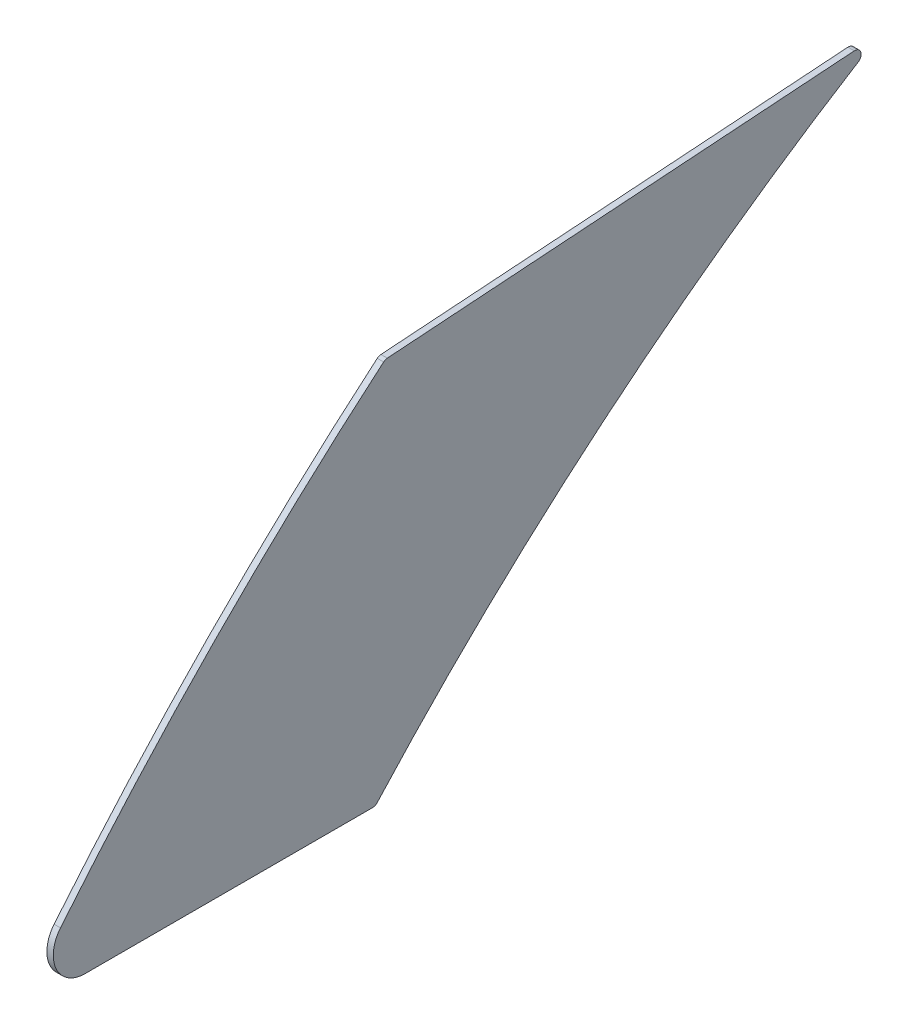
ISO-10303-21;
HEADER;
FILE_DESCRIPTION(('STEP AP214'),'2;1');
FILE_NAME('part.step','',(''),(''),'','','');
FILE_SCHEMA(('AUTOMOTIVE_DESIGN { 1 0 10303 214 1 1 1 1 }'));
ENDSEC;
DATA;
#1=APPLICATION_CONTEXT('core data for automotive mechanical design processes');
#2=APPLICATION_PROTOCOL_DEFINITION('international standard','automotive_design',2000,#1);
#3=PRODUCT_CONTEXT('',#1,'mechanical');
#4=PRODUCT('Part','Part','',(#3));
#5=PRODUCT_RELATED_PRODUCT_CATEGORY('part','',(#4));
#6=PRODUCT_DEFINITION_FORMATION('','',#4);
#7=PRODUCT_DEFINITION_CONTEXT('part definition',#1,'design');
#8=PRODUCT_DEFINITION('design','',#6,#7);
#9=PRODUCT_DEFINITION_SHAPE('','',#8);
#10=(LENGTH_UNIT() NAMED_UNIT(*) SI_UNIT(.MILLI.,.METRE.));
#11=(NAMED_UNIT(*) PLANE_ANGLE_UNIT() SI_UNIT($,.RADIAN.));
#12=(NAMED_UNIT(*) SI_UNIT($,.STERADIAN.) SOLID_ANGLE_UNIT());
#13=UNCERTAINTY_MEASURE_WITH_UNIT(LENGTH_MEASURE(1.E-05),#10,'distance_accuracy_value','');
#14=(GEOMETRIC_REPRESENTATION_CONTEXT(3) GLOBAL_UNCERTAINTY_ASSIGNED_CONTEXT((#13)) GLOBAL_UNIT_ASSIGNED_CONTEXT((#10,
#11,#12)) REPRESENTATION_CONTEXT('',''));
#15=CARTESIAN_POINT('',(0.,0.,0.));
#16=DIRECTION('',(0.,0.,1.));
#17=DIRECTION('',(1.,0.,0.));
#18=AXIS2_PLACEMENT_3D('',#15,#16,#17);
#19=CARTESIAN_POINT('',(1.,-55.,47.1687635097814));
#20=DIRECTION('',(-1.,0.,0.));
#21=DIRECTION('',(0.,0.,1.));
#22=AXIS2_PLACEMENT_3D('',#19,#20,#21);
#23=CYLINDRICAL_SURFACE('',#22,5.00000000000001);
#24=CARTESIAN_POINT('',(0.,-55.,47.1687635097814));
#25=DIRECTION('',(1.,0.,0.));
#26=DIRECTION('',(0.,0.,1.));
#27=AXIS2_PLACEMENT_3D('',#24,#25,#26);
#28=CIRCLE('',#27,5.00000000000001);
#29=CARTESIAN_POINT('',(0.,-51.8303535996389,51.0357186034796));
#30=VERTEX_POINT('',#29);
#31=CARTESIAN_POINT('',(0.,-60.,47.1687635097814));
#32=VERTEX_POINT('',#31);
#33=EDGE_CURVE('E129',#30,#32,#28,.T.);
#34=ORIENTED_EDGE('',*,*,#33,.T.);
#35=DIRECTION('',(-1.,0.,0.));
#36=VECTOR('',#35,1.);
#37=CARTESIAN_POINT('',(1.,-60.,47.1687635097814));
#38=LINE('',#37,#36);
#39=CARTESIAN_POINT('',(1.,-60.,47.1687635097814));
#40=VERTEX_POINT('',#39);
#41=EDGE_CURVE('E11',#40,#32,#38,.T.);
#42=ORIENTED_EDGE('',*,*,#41,.F.);
#43=CARTESIAN_POINT('',(1.,-55.,47.1687635097814));
#44=DIRECTION('',(1.,0.,0.));
#45=DIRECTION('',(0.,0.,1.));
#46=AXIS2_PLACEMENT_3D('',#43,#44,#45);
#47=CIRCLE('',#46,5.00000000000001);
#48=CARTESIAN_POINT('',(1.,-51.8303535996389,51.0357186034796));
#49=VERTEX_POINT('',#48);
#50=EDGE_CURVE('E143',#49,#40,#47,.T.);
#51=ORIENTED_EDGE('',*,*,#50,.F.);
#52=DIRECTION('',(-1.,0.,0.));
#53=VECTOR('',#52,1.);
#54=CARTESIAN_POINT('',(1.,-51.8303535996389,51.0357186034796));
#55=LINE('',#54,#53);
#56=EDGE_CURVE('E125',#49,#30,#55,.T.);
#57=ORIENTED_EDGE('',*,*,#56,.T.);
#58=EDGE_LOOP('',(#34,#42,#51,#57));
#59=FACE_BOUND('',#58,.T.);
#60=ADVANCED_FACE('F33',(#59),#23,.T.);
#61=CARTESIAN_POINT('',(1.,-60.,47.1687635097814));
#62=DIRECTION('',(0.,1.,0.));
#63=DIRECTION('',(0.,0.,1.));
#64=AXIS2_PLACEMENT_3D('',#61,#62,#63);
#65=PLANE('',#64);
#66=DIRECTION('',(0.,0.,-1.));
#67=VECTOR('',#66,1.);
#68=CARTESIAN_POINT('',(0.,-60.,47.1687635097814));
#69=LINE('',#68,#67);
#70=CARTESIAN_POINT('',(0.,-60.,1.99999999999999));
#71=VERTEX_POINT('',#70);
#72=EDGE_CURVE('E132',#32,#71,#69,.T.);
#73=ORIENTED_EDGE('',*,*,#72,.T.);
#74=DIRECTION('',(-1.,0.,0.));
#75=VECTOR('',#74,1.);
#76=CARTESIAN_POINT('',(1.,-60.,1.99999999999999));
#77=LINE('',#76,#75);
#78=CARTESIAN_POINT('',(1.,-60.,1.99999999999999));
#79=VERTEX_POINT('',#78);
#80=EDGE_CURVE('E41',#79,#71,#77,.T.);
#81=ORIENTED_EDGE('',*,*,#80,.F.);
#82=DIRECTION('',(0.,0.,-1.));
#83=VECTOR('',#82,1.);
#84=CARTESIAN_POINT('',(1.,-60.,47.1687635097814));
#85=LINE('',#84,#83);
#86=EDGE_CURVE('E92',#40,#79,#85,.T.);
#87=ORIENTED_EDGE('',*,*,#86,.F.);
#88=ORIENTED_EDGE('',*,*,#41,.T.);
#89=EDGE_LOOP('',(#73,#81,#87,#88));
#90=FACE_BOUND('',#89,.T.);
#91=ADVANCED_FACE('F178',(#90),#65,.F.);
#92=CARTESIAN_POINT('',(1.,-59.,1.99999999999999));
#93=DIRECTION('',(-1.,0.,0.));
#94=DIRECTION('',(0.,0.,1.));
#95=AXIS2_PLACEMENT_3D('',#92,#93,#94);
#96=CYLINDRICAL_SURFACE('',#95,1.);
#97=CARTESIAN_POINT('',(0.,-59.,1.99999999999999));
#98=DIRECTION('',(1.,0.,0.));
#99=DIRECTION('',(0.,0.,-1.));
#100=AXIS2_PLACEMENT_3D('',#97,#98,#99);
#101=CIRCLE('',#100,1.);
#102=CARTESIAN_POINT('',(0.,-59.6706210006683,1.25819984263775));
#103=VERTEX_POINT('',#102);
#104=EDGE_CURVE('E134',#71,#103,#101,.T.);
#105=ORIENTED_EDGE('',*,*,#104,.T.);
#106=DIRECTION('',(-1.,0.,0.));
#107=VECTOR('',#106,1.);
#108=CARTESIAN_POINT('',(1.,-59.6706210006683,1.25819984263775));
#109=LINE('',#108,#107);
#110=CARTESIAN_POINT('',(1.,-59.6706210006683,1.25819984263775));
#111=VERTEX_POINT('',#110);
#112=EDGE_CURVE('E150',#111,#103,#109,.T.);
#113=ORIENTED_EDGE('',*,*,#112,.F.);
#114=CARTESIAN_POINT('',(1.,-59.,1.99999999999999));
#115=DIRECTION('',(1.,0.,0.));
#116=DIRECTION('',(0.,0.,-1.));
#117=AXIS2_PLACEMENT_3D('',#114,#115,#116);
#118=CIRCLE('',#117,1.);
#119=EDGE_CURVE('E158',#79,#111,#118,.T.);
#120=ORIENTED_EDGE('',*,*,#119,.F.);
#121=ORIENTED_EDGE('',*,*,#80,.T.);
#122=EDGE_LOOP('',(#105,#113,#120,#121));
#123=FACE_BOUND('',#122,.T.);
#124=ADVANCED_FACE('F156',(#123),#96,.T.);
#125=CARTESIAN_POINT('',(1.,-294.387971234575,-258.371855234146));
#126=DIRECTION('',(-1.,0.,0.));
#127=DIRECTION('',(0.,0.,1.));
#128=AXIS2_PLACEMENT_3D('',#125,#126,#127);
#129=CYLINDRICAL_SURFACE('',#128,350.);
#130=CARTESIAN_POINT('',(0.,-294.387971234575,-258.371855234146));
#131=DIRECTION('',(-1.,0.,0.));
#132=DIRECTION('',(0.,0.,1.));
#133=AXIS2_PLACEMENT_3D('',#130,#131,#132);
#134=CIRCLE('',#133,350.);
#135=CARTESIAN_POINT('',(0.,3.30665253271911,-74.3123241577865));
#136=VERTEX_POINT('',#135);
#137=EDGE_CURVE('E136',#103,#136,#134,.T.);
#138=ORIENTED_EDGE('',*,*,#137,.T.);
#139=DIRECTION('',(-1.,0.,0.));
#140=VECTOR('',#139,1.);
#141=CARTESIAN_POINT('',(1.,3.30665253271911,-74.3123241577865));
#142=LINE('',#141,#140);
#143=CARTESIAN_POINT('',(1.,3.30665253271911,-74.3123241577865));
#144=VERTEX_POINT('',#143);
#145=EDGE_CURVE('E147',#144,#136,#142,.T.);
#146=ORIENTED_EDGE('',*,*,#145,.F.);
#147=CARTESIAN_POINT('',(1.,-294.387971234575,-258.371855234146));
#148=DIRECTION('',(-1.,0.,0.));
#149=DIRECTION('',(0.,0.,1.));
#150=AXIS2_PLACEMENT_3D('',#147,#148,#149);
#151=CIRCLE('',#150,350.);
#152=EDGE_CURVE('E170',#111,#144,#151,.T.);
#153=ORIENTED_EDGE('',*,*,#152,.F.);
#154=ORIENTED_EDGE('',*,*,#112,.T.);
#155=EDGE_LOOP('',(#138,#146,#153,#154));
#156=FACE_BOUND('',#155,.T.);
#157=ADVANCED_FACE('F166',(#156),#129,.F.);
#158=CARTESIAN_POINT('',(1.,4.15720860062574,-73.7864397832826));
#159=DIRECTION('',(-1.,0.,0.));
#160=DIRECTION('',(0.,0.,1.));
#161=AXIS2_PLACEMENT_3D('',#158,#159,#160);
#162=CYLINDRICAL_SURFACE('',#161,0.999999999999939);
#163=CARTESIAN_POINT('',(0.,4.15720860062574,-73.7864397832826));
#164=DIRECTION('',(1.,0.,0.));
#165=DIRECTION('',(0.,0.,1.));
#166=AXIS2_PLACEMENT_3D('',#163,#164,#165);
#167=CIRCLE('',#166,0.999999999999939);
#168=CARTESIAN_POINT('',(0.,5.1547726508855,-73.7166833095385));
#169=VERTEX_POINT('',#168);
#170=EDGE_CURVE('E138',#136,#169,#167,.T.);
#171=ORIENTED_EDGE('',*,*,#170,.T.);
#172=DIRECTION('',(-1.,0.,0.));
#173=VECTOR('',#172,1.);
#174=CARTESIAN_POINT('',(1.,5.1547726508855,-73.7166833095385));
#175=LINE('',#174,#173);
#176=CARTESIAN_POINT('',(1.,5.1547726508855,-73.7166833095385));
#177=VERTEX_POINT('',#176);
#178=EDGE_CURVE('E120',#177,#169,#175,.T.);
#179=ORIENTED_EDGE('',*,*,#178,.F.);
#180=CARTESIAN_POINT('',(1.,4.15720860062574,-73.7864397832826));
#181=DIRECTION('',(1.,0.,0.));
#182=DIRECTION('',(0.,0.,1.));
#183=AXIS2_PLACEMENT_3D('',#180,#181,#182);
#184=CIRCLE('',#183,0.999999999999939);
#185=EDGE_CURVE('E111',#144,#177,#184,.T.);
#186=ORIENTED_EDGE('',*,*,#185,.F.);
#187=ORIENTED_EDGE('',*,*,#145,.T.);
#188=EDGE_LOOP('',(#171,#179,#186,#187));
#189=FACE_BOUND('',#188,.T.);
#190=ADVANCED_FACE('F169',(#189),#162,.T.);
#191=CARTESIAN_POINT('',(1.,0.0228331316280386,-0.326528995008149));
#192=DIRECTION('',(0.,-0.997564050259824,-0.0697564737441256));
#193=DIRECTION('',(0.,0.0697564737441256,-0.997564050259824));
#194=AXIS2_PLACEMENT_3D('',#191,#192,#193);
#195=PLANE('',#194);
#196=DIRECTION('',(0.,-0.0697564737441256,0.997564050259824));
#197=VECTOR('',#196,1.);
#198=CARTESIAN_POINT('',(0.,0.0228331316280386,-0.326528995008149));
#199=LINE('',#198,#197);
#200=CARTESIAN_POINT('',(0.,0.0228331316280386,-0.326528995008149));
#201=VERTEX_POINT('',#200);
#202=EDGE_CURVE('E119',#169,#201,#199,.T.);
#203=ORIENTED_EDGE('',*,*,#202,.T.);
#204=DIRECTION('',(-1.,0.,0.));
#205=VECTOR('',#204,1.);
#206=CARTESIAN_POINT('',(1.,0.0228331316280386,-0.326528995008149));
#207=LINE('',#206,#205);
#208=CARTESIAN_POINT('',(1.,0.0228331316280386,-0.326528995008149));
#209=VERTEX_POINT('',#208);
#210=EDGE_CURVE('E116',#209,#201,#207,.T.);
#211=ORIENTED_EDGE('',*,*,#210,.F.);
#212=DIRECTION('',(0.,-0.0697564737441256,0.997564050259824));
#213=VECTOR('',#212,1.);
#214=CARTESIAN_POINT('',(1.,0.0228331316280386,-0.326528995008149));
#215=LINE('',#214,#213);
#216=EDGE_CURVE('E105',#177,#209,#215,.T.);
#217=ORIENTED_EDGE('',*,*,#216,.F.);
#218=ORIENTED_EDGE('',*,*,#178,.T.);
#219=EDGE_LOOP('',(#203,#211,#217,#218));
#220=FACE_BOUND('',#219,.T.);
#221=ADVANCED_FACE('F117',(#220),#195,.F.);
#222=CARTESIAN_POINT('',(1.,-0.974730918631761,-0.396285468752273));
#223=DIRECTION('',(-1.,0.,0.));
#224=DIRECTION('',(0.,0.,1.));
#225=AXIS2_PLACEMENT_3D('',#222,#223,#224);
#226=CYLINDRICAL_SURFACE('',#225,0.999999999999999);
#227=CARTESIAN_POINT('',(0.,-0.974730918631761,-0.396285468752273));
#228=DIRECTION('',(1.,0.,0.));
#229=DIRECTION('',(0.,0.,-1.));
#230=AXIS2_PLACEMENT_3D('',#227,#228,#229);
#231=CIRCLE('',#230,0.999999999999999);
#232=CARTESIAN_POINT('',(0.,-0.211755142416487,0.250141607497398));
#233=VERTEX_POINT('',#232);
#234=EDGE_CURVE('E78',#201,#233,#231,.T.);
#235=ORIENTED_EDGE('',*,*,#234,.T.);
#236=DIRECTION('',(-1.,0.,0.));
#237=VECTOR('',#236,1.);
#238=CARTESIAN_POINT('',(1.,-0.211755142416487,0.250141607497398));
#239=LINE('',#238,#237);
#240=CARTESIAN_POINT('',(1.,-0.211755142416487,0.250141607497398));
#241=VERTEX_POINT('',#240);
#242=EDGE_CURVE('E121',#241,#233,#239,.T.);
#243=ORIENTED_EDGE('',*,*,#242,.F.);
#244=CARTESIAN_POINT('',(1.,-0.974730918631761,-0.396285468752273));
#245=DIRECTION('',(1.,0.,0.));
#246=DIRECTION('',(0.,0.,-1.));
#247=AXIS2_PLACEMENT_3D('',#244,#245,#246);
#248=CIRCLE('',#247,0.999999999999999);
#249=EDGE_CURVE('E109',#209,#241,#248,.T.);
#250=ORIENTED_EDGE('',*,*,#249,.F.);
#251=ORIENTED_EDGE('',*,*,#210,.T.);
#252=EDGE_LOOP('',(#235,#243,#250,#251));
#253=FACE_BOUND('',#252,.T.);
#254=ADVANCED_FACE('F123',(#253),#226,.T.);
#255=CARTESIAN_POINT('',(1.,-305.402065628526,-258.320688892371));
#256=DIRECTION('',(-1.,0.,0.));
#257=DIRECTION('',(0.,0.,1.));
#258=AXIS2_PLACEMENT_3D('',#255,#256,#257);
#259=CYLINDRICAL_SURFACE('',#258,400.);
#260=CARTESIAN_POINT('',(0.,-305.402065628526,-258.320688892371));
#261=DIRECTION('',(1.,0.,0.));
#262=DIRECTION('',(0.,0.,1.));
#263=AXIS2_PLACEMENT_3D('',#260,#261,#262);
#264=CIRCLE('',#263,400.);
#265=EDGE_CURVE('E84',#233,#30,#264,.T.);
#266=ORIENTED_EDGE('',*,*,#265,.T.);
#267=ORIENTED_EDGE('',*,*,#56,.F.);
#268=CARTESIAN_POINT('',(1.,-305.402065628526,-258.320688892371));
#269=DIRECTION('',(1.,0.,0.));
#270=DIRECTION('',(0.,0.,1.));
#271=AXIS2_PLACEMENT_3D('',#268,#269,#270);
#272=CIRCLE('',#271,400.);
#273=EDGE_CURVE('E49',#241,#49,#272,.T.);
#274=ORIENTED_EDGE('',*,*,#273,.F.);
#275=ORIENTED_EDGE('',*,*,#242,.T.);
#276=EDGE_LOOP('',(#266,#267,#274,#275));
#277=FACE_BOUND('',#276,.T.);
#278=ADVANCED_FACE('F194',(#277),#259,.T.);
#279=CARTESIAN_POINT('',(1.,-55.,47.1687635097814));
#280=DIRECTION('',(-1.,0.,0.));
#281=DIRECTION('',(0.,0.,1.));
#282=AXIS2_PLACEMENT_3D('',#279,#280,#281);
#283=PLANE('',#282);
#284=ORIENTED_EDGE('',*,*,#50,.T.);
#285=ORIENTED_EDGE('',*,*,#86,.T.);
#286=ORIENTED_EDGE('',*,*,#119,.T.);
#287=ORIENTED_EDGE('',*,*,#152,.T.);
#288=ORIENTED_EDGE('',*,*,#185,.T.);
#289=ORIENTED_EDGE('',*,*,#216,.T.);
#290=ORIENTED_EDGE('',*,*,#249,.T.);
#291=ORIENTED_EDGE('',*,*,#273,.T.);
#292=EDGE_LOOP('',(#284,#285,#286,#287,#288,#289,#290,#291));
#293=FACE_BOUND('',#292,.T.);
#294=ADVANCED_FACE('F107',(#293),#283,.F.);
#295=CARTESIAN_POINT('',(0.,-55.,47.1687635097814));
#296=DIRECTION('',(-1.,0.,0.));
#297=DIRECTION('',(0.,0.,1.));
#298=AXIS2_PLACEMENT_3D('',#295,#296,#297);
#299=PLANE('',#298);
#300=ORIENTED_EDGE('',*,*,#33,.F.);
#301=ORIENTED_EDGE('',*,*,#265,.F.);
#302=ORIENTED_EDGE('',*,*,#234,.F.);
#303=ORIENTED_EDGE('',*,*,#202,.F.);
#304=ORIENTED_EDGE('',*,*,#170,.F.);
#305=ORIENTED_EDGE('',*,*,#137,.F.);
#306=ORIENTED_EDGE('',*,*,#104,.F.);
#307=ORIENTED_EDGE('',*,*,#72,.F.);
#308=EDGE_LOOP('',(#300,#301,#302,#303,#304,#305,#306,#307));
#309=FACE_BOUND('',#308,.T.);
#310=ADVANCED_FACE('F162',(#309),#299,.T.);
#311=CLOSED_SHELL('',(#60,#91,#124,#157,#190,#221,#254,#278,#294,#310));
#312=MANIFOLD_SOLID_BREP('B2',#311);
#313=ADVANCED_BREP_SHAPE_REPRESENTATION('',(#18,#312),#14);
#314=SHAPE_DEFINITION_REPRESENTATION(#9,#313);
ENDSEC;
END-ISO-10303-21;
